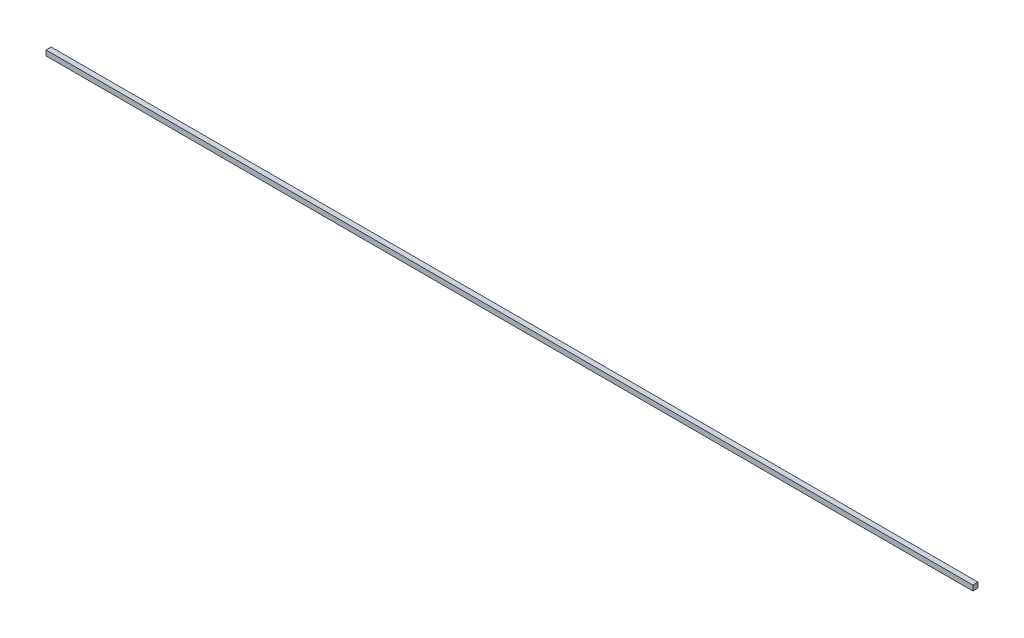
ISO-10303-21;
HEADER;
FILE_DESCRIPTION(('STEP AP214'),'2;1');
FILE_NAME('part.step','',(''),(''),'','','');
FILE_SCHEMA(('AUTOMOTIVE_DESIGN { 1 0 10303 214 1 1 1 1 }'));
ENDSEC;
DATA;
#1=APPLICATION_CONTEXT('core data for automotive mechanical design processes');
#2=APPLICATION_PROTOCOL_DEFINITION('international standard','automotive_design',2000,#1);
#3=PRODUCT_CONTEXT('',#1,'mechanical');
#4=PRODUCT('Part','Part','',(#3));
#5=PRODUCT_RELATED_PRODUCT_CATEGORY('part','',(#4));
#6=PRODUCT_DEFINITION_FORMATION('','',#4);
#7=PRODUCT_DEFINITION_CONTEXT('part definition',#1,'design');
#8=PRODUCT_DEFINITION('design','',#6,#7);
#9=PRODUCT_DEFINITION_SHAPE('','',#8);
#10=(LENGTH_UNIT() NAMED_UNIT(*) SI_UNIT(.MILLI.,.METRE.));
#11=(NAMED_UNIT(*) PLANE_ANGLE_UNIT() SI_UNIT($,.RADIAN.));
#12=(NAMED_UNIT(*) SI_UNIT($,.STERADIAN.) SOLID_ANGLE_UNIT());
#13=UNCERTAINTY_MEASURE_WITH_UNIT(LENGTH_MEASURE(1.E-05),#10,'distance_accuracy_value','');
#14=(GEOMETRIC_REPRESENTATION_CONTEXT(3) GLOBAL_UNCERTAINTY_ASSIGNED_CONTEXT((#13)) GLOBAL_UNIT_ASSIGNED_CONTEXT((#10,
#11,#12)) REPRESENTATION_CONTEXT('',''));
#15=CARTESIAN_POINT('',(0.,0.,0.));
#16=DIRECTION('',(0.,0.,1.));
#17=DIRECTION('',(1.,0.,0.));
#18=AXIS2_PLACEMENT_3D('',#15,#16,#17);
#19=CARTESIAN_POINT('',(900.,2.5,2.5));
#20=DIRECTION('',(0.,0.,-1.));
#21=DIRECTION('',(0.,1.,0.));
#22=AXIS2_PLACEMENT_3D('',#19,#20,#21);
#23=PLANE('',#22);
#24=DIRECTION('',(0.,-1.,0.));
#25=VECTOR('',#24,1.);
#26=CARTESIAN_POINT('',(0.,2.5,2.5));
#27=LINE('',#26,#25);
#28=CARTESIAN_POINT('',(0.,2.5,2.5));
#29=VERTEX_POINT('',#28);
#30=CARTESIAN_POINT('',(0.,-2.5,2.5));
#31=VERTEX_POINT('',#30);
#32=EDGE_CURVE('E102',#29,#31,#27,.T.);
#33=ORIENTED_EDGE('',*,*,#32,.T.);
#34=DIRECTION('',(-1.,0.,0.));
#35=VECTOR('',#34,1.);
#36=CARTESIAN_POINT('',(900.,-2.5,2.5));
#37=LINE('',#36,#35);
#38=CARTESIAN_POINT('',(900.,-2.5,2.5));
#39=VERTEX_POINT('',#38);
#40=EDGE_CURVE('E11',#39,#31,#37,.T.);
#41=ORIENTED_EDGE('',*,*,#40,.F.);
#42=DIRECTION('',(0.,-1.,0.));
#43=VECTOR('',#42,1.);
#44=CARTESIAN_POINT('',(900.,2.5,2.5));
#45=LINE('',#44,#43);
#46=CARTESIAN_POINT('',(900.,2.5,2.5));
#47=VERTEX_POINT('',#46);
#48=EDGE_CURVE('E90',#47,#39,#45,.T.);
#49=ORIENTED_EDGE('',*,*,#48,.F.);
#50=DIRECTION('',(-1.,0.,0.));
#51=VECTOR('',#50,1.);
#52=CARTESIAN_POINT('',(900.,2.5,2.5));
#53=LINE('',#52,#51);
#54=EDGE_CURVE('E98',#47,#29,#53,.T.);
#55=ORIENTED_EDGE('',*,*,#54,.T.);
#56=EDGE_LOOP('',(#33,#41,#49,#55));
#57=FACE_BOUND('',#56,.T.);
#58=ADVANCED_FACE('F39',(#57),#23,.F.);
#59=CARTESIAN_POINT('',(900.,-2.5,-2.5));
#60=DIRECTION('',(0.,1.,0.));
#61=DIRECTION('',(0.,0.,1.));
#62=AXIS2_PLACEMENT_3D('',#59,#60,#61);
#63=PLANE('',#62);
#64=DIRECTION('',(0.,0.,-1.));
#65=VECTOR('',#64,1.);
#66=CARTESIAN_POINT('',(0.,-2.5,-2.5));
#67=LINE('',#66,#65);
#68=CARTESIAN_POINT('',(0.,-2.5,-2.5));
#69=VERTEX_POINT('',#68);
#70=EDGE_CURVE('E94',#31,#69,#67,.T.);
#71=ORIENTED_EDGE('',*,*,#70,.T.);
#72=DIRECTION('',(-1.,0.,0.));
#73=VECTOR('',#72,1.);
#74=CARTESIAN_POINT('',(900.,-2.5,-2.5));
#75=LINE('',#74,#73);
#76=CARTESIAN_POINT('',(900.,-2.5,-2.5));
#77=VERTEX_POINT('',#76);
#78=EDGE_CURVE('E47',#77,#69,#75,.T.);
#79=ORIENTED_EDGE('',*,*,#78,.F.);
#80=DIRECTION('',(0.,0.,-1.));
#81=VECTOR('',#80,1.);
#82=CARTESIAN_POINT('',(900.,-2.5,-2.5));
#83=LINE('',#82,#81);
#84=EDGE_CURVE('E85',#39,#77,#83,.T.);
#85=ORIENTED_EDGE('',*,*,#84,.F.);
#86=ORIENTED_EDGE('',*,*,#40,.T.);
#87=EDGE_LOOP('',(#71,#79,#85,#86));
#88=FACE_BOUND('',#87,.T.);
#89=ADVANCED_FACE('F93',(#88),#63,.F.);
#90=CARTESIAN_POINT('',(900.,2.5,-2.5));
#91=DIRECTION('',(0.,0.,1.));
#92=DIRECTION('',(0.,-1.,0.));
#93=AXIS2_PLACEMENT_3D('',#90,#91,#92);
#94=PLANE('',#93);
#95=DIRECTION('',(0.,1.,0.));
#96=VECTOR('',#95,1.);
#97=CARTESIAN_POINT('',(0.,2.5,-2.5));
#98=LINE('',#97,#96);
#99=CARTESIAN_POINT('',(0.,2.5,-2.5));
#100=VERTEX_POINT('',#99);
#101=EDGE_CURVE('E72',#69,#100,#98,.T.);
#102=ORIENTED_EDGE('',*,*,#101,.T.);
#103=DIRECTION('',(-1.,0.,0.));
#104=VECTOR('',#103,1.);
#105=CARTESIAN_POINT('',(900.,2.5,-2.5));
#106=LINE('',#105,#104);
#107=CARTESIAN_POINT('',(900.,2.5,-2.5));
#108=VERTEX_POINT('',#107);
#109=EDGE_CURVE('E95',#108,#100,#106,.T.);
#110=ORIENTED_EDGE('',*,*,#109,.F.);
#111=DIRECTION('',(0.,1.,0.));
#112=VECTOR('',#111,1.);
#113=CARTESIAN_POINT('',(900.,2.5,-2.5));
#114=LINE('',#113,#112);
#115=EDGE_CURVE('E88',#77,#108,#114,.T.);
#116=ORIENTED_EDGE('',*,*,#115,.F.);
#117=ORIENTED_EDGE('',*,*,#78,.T.);
#118=EDGE_LOOP('',(#102,#110,#116,#117));
#119=FACE_BOUND('',#118,.T.);
#120=ADVANCED_FACE('F96',(#119),#94,.F.);
#121=CARTESIAN_POINT('',(900.,2.5,-2.5));
#122=DIRECTION('',(0.,-1.,0.));
#123=DIRECTION('',(0.,0.,-1.));
#124=AXIS2_PLACEMENT_3D('',#121,#122,#123);
#125=PLANE('',#124);
#126=DIRECTION('',(0.,0.,1.));
#127=VECTOR('',#126,1.);
#128=CARTESIAN_POINT('',(0.,2.5,-2.5));
#129=LINE('',#128,#127);
#130=EDGE_CURVE('E78',#100,#29,#129,.T.);
#131=ORIENTED_EDGE('',*,*,#130,.T.);
#132=ORIENTED_EDGE('',*,*,#54,.F.);
#133=DIRECTION('',(0.,0.,1.));
#134=VECTOR('',#133,1.);
#135=CARTESIAN_POINT('',(900.,2.5,-2.5));
#136=LINE('',#135,#134);
#137=EDGE_CURVE('E55',#108,#47,#136,.T.);
#138=ORIENTED_EDGE('',*,*,#137,.F.);
#139=ORIENTED_EDGE('',*,*,#109,.T.);
#140=EDGE_LOOP('',(#131,#132,#138,#139));
#141=FACE_BOUND('',#140,.T.);
#142=ADVANCED_FACE('F109',(#141),#125,.F.);
#143=CARTESIAN_POINT('',(900.,0.,0.));
#144=DIRECTION('',(-1.,0.,0.));
#145=DIRECTION('',(0.,0.,1.));
#146=AXIS2_PLACEMENT_3D('',#143,#144,#145);
#147=PLANE('',#146);
#148=ORIENTED_EDGE('',*,*,#48,.T.);
#149=ORIENTED_EDGE('',*,*,#84,.T.);
#150=ORIENTED_EDGE('',*,*,#115,.T.);
#151=ORIENTED_EDGE('',*,*,#137,.T.);
#152=EDGE_LOOP('',(#148,#149,#150,#151));
#153=FACE_BOUND('',#152,.T.);
#154=ADVANCED_FACE('F86',(#153),#147,.F.);
#155=CARTESIAN_POINT('',(0.,0.,0.));
#156=DIRECTION('',(-1.,0.,0.));
#157=DIRECTION('',(0.,0.,1.));
#158=AXIS2_PLACEMENT_3D('',#155,#156,#157);
#159=PLANE('',#158);
#160=ORIENTED_EDGE('',*,*,#32,.F.);
#161=ORIENTED_EDGE('',*,*,#130,.F.);
#162=ORIENTED_EDGE('',*,*,#101,.F.);
#163=ORIENTED_EDGE('',*,*,#70,.F.);
#164=EDGE_LOOP('',(#160,#161,#162,#163));
#165=FACE_BOUND('',#164,.T.);
#166=ADVANCED_FACE('F112',(#165),#159,.T.);
#167=CLOSED_SHELL('',(#58,#89,#120,#142,#154,#166));
#168=MANIFOLD_SOLID_BREP('B2',#167);
#169=ADVANCED_BREP_SHAPE_REPRESENTATION('',(#18,#168),#14);
#170=SHAPE_DEFINITION_REPRESENTATION(#9,#169);
ENDSEC;
END-ISO-10303-21;
